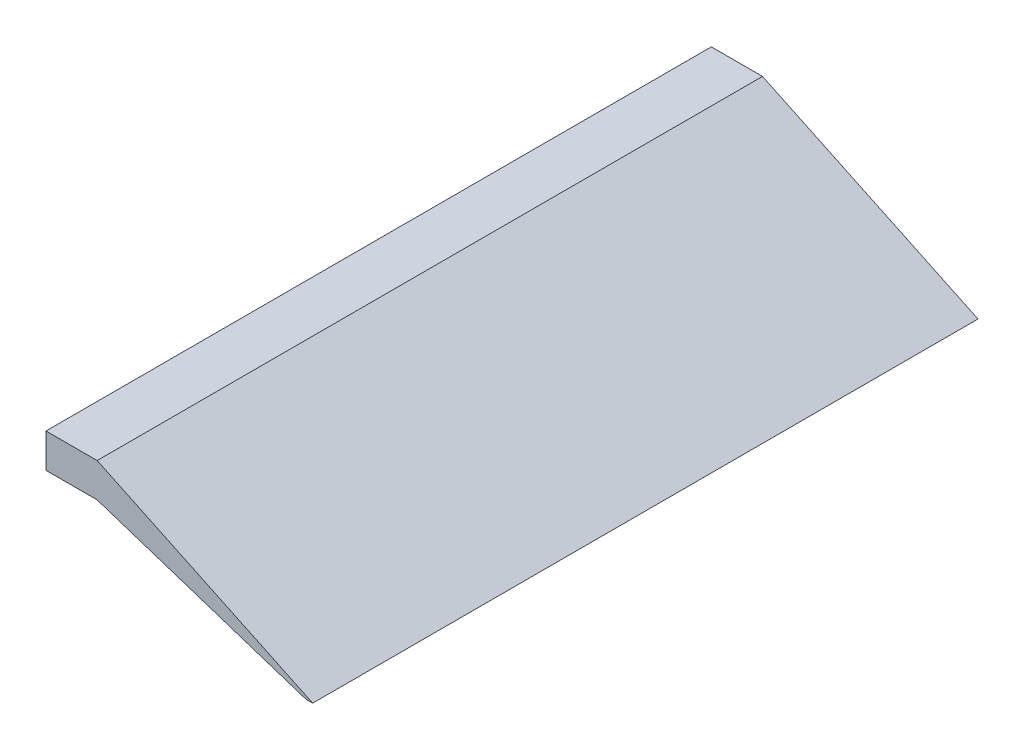
ISO-10303-21;
HEADER;
FILE_DESCRIPTION(('STEP AP214'),'2;1');
FILE_NAME('part.step','',(''),(''),'','','');
FILE_SCHEMA(('AUTOMOTIVE_DESIGN { 1 0 10303 214 1 1 1 1 }'));
ENDSEC;
DATA;
#1=APPLICATION_CONTEXT('core data for automotive mechanical design processes');
#2=APPLICATION_PROTOCOL_DEFINITION('international standard','automotive_design',2000,#1);
#3=PRODUCT_CONTEXT('',#1,'mechanical');
#4=PRODUCT('Part','Part','',(#3));
#5=PRODUCT_RELATED_PRODUCT_CATEGORY('part','',(#4));
#6=PRODUCT_DEFINITION_FORMATION('','',#4);
#7=PRODUCT_DEFINITION_CONTEXT('part definition',#1,'design');
#8=PRODUCT_DEFINITION('design','',#6,#7);
#9=PRODUCT_DEFINITION_SHAPE('','',#8);
#10=(LENGTH_UNIT() NAMED_UNIT(*) SI_UNIT(.MILLI.,.METRE.));
#11=(NAMED_UNIT(*) PLANE_ANGLE_UNIT() SI_UNIT($,.RADIAN.));
#12=(NAMED_UNIT(*) SI_UNIT($,.STERADIAN.) SOLID_ANGLE_UNIT());
#13=UNCERTAINTY_MEASURE_WITH_UNIT(LENGTH_MEASURE(1.E-05),#10,'distance_accuracy_value','');
#14=(GEOMETRIC_REPRESENTATION_CONTEXT(3) GLOBAL_UNCERTAINTY_ASSIGNED_CONTEXT((#13)) GLOBAL_UNIT_ASSIGNED_CONTEXT((#10,
#11,#12)) REPRESENTATION_CONTEXT('',''));
#15=CARTESIAN_POINT('',(0.,0.,0.));
#16=DIRECTION('',(0.,0.,1.));
#17=DIRECTION('',(1.,0.,0.));
#18=AXIS2_PLACEMENT_3D('',#15,#16,#17);
#19=CARTESIAN_POINT('',(-15.,9.99999999999999,-97.5));
#20=DIRECTION('',(0.,0.,-1.));
#21=DIRECTION('',(-1.,0.,0.));
#22=AXIS2_PLACEMENT_3D('',#19,#20,#21);
#23=PLANE('',#22);
#24=DIRECTION('',(1.,0.,0.));
#25=VECTOR('',#24,1.);
#26=CARTESIAN_POINT('',(-15.,9.99999999999999,-97.5));
#27=LINE('',#26,#25);
#28=CARTESIAN_POINT('',(-15.,9.99999999999999,-97.5));
#29=VERTEX_POINT('',#28);
#30=CARTESIAN_POINT('',(0.,9.99999999999999,-97.5));
#31=VERTEX_POINT('',#30);
#32=EDGE_CURVE('E42',#29,#31,#27,.T.);
#33=ORIENTED_EDGE('',*,*,#32,.T.);
#34=DIRECTION('',(0.903292533340969,-0.429025173166395,0.));
#35=VECTOR('',#34,1.);
#36=CARTESIAN_POINT('',(0.,9.99999999999999,-97.5));
#37=LINE('',#36,#35);
#38=CARTESIAN_POINT('',(63.1636036650907,-20.,-97.5));
#39=VERTEX_POINT('',#38);
#40=EDGE_CURVE('E130',#31,#39,#37,.T.);
#41=ORIENTED_EDGE('',*,*,#40,.T.);
#42=DIRECTION('',(1.,0.,0.));
#43=VECTOR('',#42,1.);
#44=CARTESIAN_POINT('',(61.1636036650907,-20.,-97.5));
#45=LINE('',#44,#43);
#46=CARTESIAN_POINT('',(61.1636036650907,-20.,-97.5));
#47=VERTEX_POINT('',#46);
#48=EDGE_CURVE('E113',#47,#39,#45,.T.);
#49=ORIENTED_EDGE('',*,*,#48,.F.);
#50=DIRECTION('',(0.950476016379504,-0.310797912295672,0.));
#51=VECTOR('',#50,1.);
#52=CARTESIAN_POINT('',(0.,0.,-97.5));
#53=LINE('',#52,#51);
#54=CARTESIAN_POINT('',(0.,0.,-97.5));
#55=VERTEX_POINT('',#54);
#56=EDGE_CURVE('E123',#55,#47,#53,.T.);
#57=ORIENTED_EDGE('',*,*,#56,.F.);
#58=DIRECTION('',(1.,0.,0.));
#59=VECTOR('',#58,1.);
#60=CARTESIAN_POINT('',(-15.,0.,-97.5));
#61=LINE('',#60,#59);
#62=CARTESIAN_POINT('',(-15.,0.,-97.5));
#63=VERTEX_POINT('',#62);
#64=EDGE_CURVE('E11',#63,#55,#61,.T.);
#65=ORIENTED_EDGE('',*,*,#64,.F.);
#66=DIRECTION('',(0.,1.,0.));
#67=VECTOR('',#66,1.);
#68=CARTESIAN_POINT('',(-15.,9.99999999999999,-97.5));
#69=LINE('',#68,#67);
#70=EDGE_CURVE('E137',#63,#29,#69,.T.);
#71=ORIENTED_EDGE('',*,*,#70,.T.);
#72=EDGE_LOOP('',(#33,#41,#49,#57,#65,#71));
#73=FACE_BOUND('',#72,.T.);
#74=ADVANCED_FACE('F39',(#73),#23,.T.);
#75=CARTESIAN_POINT('',(-15.,0.,97.5));
#76=DIRECTION('',(0.,-1.,0.));
#77=DIRECTION('',(0.,0.,-1.));
#78=AXIS2_PLACEMENT_3D('',#75,#76,#77);
#79=PLANE('',#78);
#80=DIRECTION('',(0.,0.,-1.));
#81=VECTOR('',#80,1.);
#82=CARTESIAN_POINT('',(0.,0.,97.5));
#83=LINE('',#82,#81);
#84=CARTESIAN_POINT('',(0.,0.,97.5));
#85=VERTEX_POINT('',#84);
#86=EDGE_CURVE('E141',#85,#55,#83,.T.);
#87=ORIENTED_EDGE('',*,*,#86,.F.);
#88=DIRECTION('',(1.,0.,0.));
#89=VECTOR('',#88,1.);
#90=CARTESIAN_POINT('',(-15.,0.,97.5));
#91=LINE('',#90,#89);
#92=CARTESIAN_POINT('',(-15.,0.,97.5));
#93=VERTEX_POINT('',#92);
#94=EDGE_CURVE('E49',#93,#85,#91,.T.);
#95=ORIENTED_EDGE('',*,*,#94,.F.);
#96=DIRECTION('',(0.,0.,-1.));
#97=VECTOR('',#96,1.);
#98=CARTESIAN_POINT('',(-15.,0.,97.5));
#99=LINE('',#98,#97);
#100=EDGE_CURVE('E147',#93,#63,#99,.T.);
#101=ORIENTED_EDGE('',*,*,#100,.T.);
#102=ORIENTED_EDGE('',*,*,#64,.T.);
#103=EDGE_LOOP('',(#87,#95,#101,#102));
#104=FACE_BOUND('',#103,.T.);
#105=ADVANCED_FACE('F169',(#104),#79,.T.);
#106=CARTESIAN_POINT('',(-15.,9.99999999999999,97.5));
#107=DIRECTION('',(0.,0.,1.));
#108=DIRECTION('',(1.,0.,0.));
#109=AXIS2_PLACEMENT_3D('',#106,#107,#108);
#110=PLANE('',#109);
#111=ORIENTED_EDGE('',*,*,#94,.T.);
#112=DIRECTION('',(0.950476016379504,-0.310797912295672,0.));
#113=VECTOR('',#112,1.);
#114=CARTESIAN_POINT('',(0.,0.,97.5));
#115=LINE('',#114,#113);
#116=CARTESIAN_POINT('',(61.1636036650907,-20.,97.5));
#117=VERTEX_POINT('',#116);
#118=EDGE_CURVE('E103',#85,#117,#115,.T.);
#119=ORIENTED_EDGE('',*,*,#118,.T.);
#120=DIRECTION('',(1.,0.,0.));
#121=VECTOR('',#120,1.);
#122=CARTESIAN_POINT('',(61.1636036650907,-20.,97.5));
#123=LINE('',#122,#121);
#124=CARTESIAN_POINT('',(63.1636036650907,-20.,97.5));
#125=VERTEX_POINT('',#124);
#126=EDGE_CURVE('E97',#117,#125,#123,.T.);
#127=ORIENTED_EDGE('',*,*,#126,.T.);
#128=DIRECTION('',(0.903292533340969,-0.429025173166395,0.));
#129=VECTOR('',#128,1.);
#130=CARTESIAN_POINT('',(0.,9.99999999999999,97.5));
#131=LINE('',#130,#129);
#132=CARTESIAN_POINT('',(0.,9.99999999999999,97.5));
#133=VERTEX_POINT('',#132);
#134=EDGE_CURVE('E101',#133,#125,#131,.T.);
#135=ORIENTED_EDGE('',*,*,#134,.F.);
#136=DIRECTION('',(1.,0.,0.));
#137=VECTOR('',#136,1.);
#138=CARTESIAN_POINT('',(-15.,9.99999999999999,97.5));
#139=LINE('',#138,#137);
#140=CARTESIAN_POINT('',(-15.,9.99999999999999,97.5));
#141=VERTEX_POINT('',#140);
#142=EDGE_CURVE('E72',#141,#133,#139,.T.);
#143=ORIENTED_EDGE('',*,*,#142,.F.);
#144=DIRECTION('',(0.,-1.,0.));
#145=VECTOR('',#144,1.);
#146=CARTESIAN_POINT('',(-15.,9.99999999999999,97.5));
#147=LINE('',#146,#145);
#148=EDGE_CURVE('E144',#141,#93,#147,.T.);
#149=ORIENTED_EDGE('',*,*,#148,.T.);
#150=EDGE_LOOP('',(#111,#119,#127,#135,#143,#149));
#151=FACE_BOUND('',#150,.T.);
#152=ADVANCED_FACE('F99',(#151),#110,.T.);
#153=CARTESIAN_POINT('',(-15.,9.99999999999999,97.5));
#154=DIRECTION('',(0.,1.,0.));
#155=DIRECTION('',(0.,0.,1.));
#156=AXIS2_PLACEMENT_3D('',#153,#154,#155);
#157=PLANE('',#156);
#158=DIRECTION('',(0.,0.,1.));
#159=VECTOR('',#158,1.);
#160=CARTESIAN_POINT('',(0.,9.99999999999999,97.5));
#161=LINE('',#160,#159);
#162=EDGE_CURVE('E121',#31,#133,#161,.T.);
#163=ORIENTED_EDGE('',*,*,#162,.F.);
#164=ORIENTED_EDGE('',*,*,#32,.F.);
#165=DIRECTION('',(0.,0.,1.));
#166=VECTOR('',#165,1.);
#167=CARTESIAN_POINT('',(-15.,9.99999999999999,97.5));
#168=LINE('',#167,#166);
#169=EDGE_CURVE('E140',#29,#141,#168,.T.);
#170=ORIENTED_EDGE('',*,*,#169,.T.);
#171=ORIENTED_EDGE('',*,*,#142,.T.);
#172=EDGE_LOOP('',(#163,#164,#170,#171));
#173=FACE_BOUND('',#172,.T.);
#174=ADVANCED_FACE('F159',(#173),#157,.T.);
#175=CARTESIAN_POINT('',(-15.,0.,0.));
#176=DIRECTION('',(1.,0.,0.));
#177=DIRECTION('',(0.,0.,-1.));
#178=AXIS2_PLACEMENT_3D('',#175,#176,#177);
#179=PLANE('',#178);
#180=ORIENTED_EDGE('',*,*,#70,.F.);
#181=ORIENTED_EDGE('',*,*,#100,.F.);
#182=ORIENTED_EDGE('',*,*,#148,.F.);
#183=ORIENTED_EDGE('',*,*,#169,.F.);
#184=EDGE_LOOP('',(#180,#181,#182,#183));
#185=FACE_BOUND('',#184,.T.);
#186=ADVANCED_FACE('F161',(#185),#179,.F.);
#187=CARTESIAN_POINT('',(0.,0.,97.5));
#188=DIRECTION('',(0.310797912295672,0.950476016379504,0.));
#189=DIRECTION('',(-0.950476016379504,0.310797912295672,0.));
#190=AXIS2_PLACEMENT_3D('',#187,#188,#189);
#191=PLANE('',#190);
#192=ORIENTED_EDGE('',*,*,#56,.T.);
#193=DIRECTION('',(0.,0.,-1.));
#194=VECTOR('',#193,1.);
#195=CARTESIAN_POINT('',(61.1636036650907,-20.,97.5));
#196=LINE('',#195,#194);
#197=EDGE_CURVE('E118',#117,#47,#196,.T.);
#198=ORIENTED_EDGE('',*,*,#197,.F.);
#199=ORIENTED_EDGE('',*,*,#118,.F.);
#200=ORIENTED_EDGE('',*,*,#86,.T.);
#201=EDGE_LOOP('',(#192,#198,#199,#200));
#202=FACE_BOUND('',#201,.T.);
#203=ADVANCED_FACE('F166',(#202),#191,.F.);
#204=CARTESIAN_POINT('',(61.1636036650907,-20.,97.5));
#205=DIRECTION('',(0.,1.,0.));
#206=DIRECTION('',(0.,0.,1.));
#207=AXIS2_PLACEMENT_3D('',#204,#205,#206);
#208=PLANE('',#207);
#209=ORIENTED_EDGE('',*,*,#48,.T.);
#210=DIRECTION('',(0.,0.,-1.));
#211=VECTOR('',#210,1.);
#212=CARTESIAN_POINT('',(63.1636036650907,-20.,97.5));
#213=LINE('',#212,#211);
#214=EDGE_CURVE('E110',#125,#39,#213,.T.);
#215=ORIENTED_EDGE('',*,*,#214,.F.);
#216=ORIENTED_EDGE('',*,*,#126,.F.);
#217=ORIENTED_EDGE('',*,*,#197,.T.);
#218=EDGE_LOOP('',(#209,#215,#216,#217));
#219=FACE_BOUND('',#218,.T.);
#220=ADVANCED_FACE('F111',(#219),#208,.F.);
#221=CARTESIAN_POINT('',(0.,9.99999999999999,97.5));
#222=DIRECTION('',(0.429025173166395,0.903292533340969,0.));
#223=DIRECTION('',(-0.903292533340969,0.429025173166395,0.));
#224=AXIS2_PLACEMENT_3D('',#221,#222,#223);
#225=PLANE('',#224);
#226=ORIENTED_EDGE('',*,*,#40,.F.);
#227=ORIENTED_EDGE('',*,*,#162,.T.);
#228=ORIENTED_EDGE('',*,*,#134,.T.);
#229=ORIENTED_EDGE('',*,*,#214,.T.);
#230=EDGE_LOOP('',(#226,#227,#228,#229));
#231=FACE_BOUND('',#230,.T.);
#232=ADVANCED_FACE('F120',(#231),#225,.T.);
#233=CLOSED_SHELL('',(#74,#105,#152,#174,#186,#203,#220,#232));
#234=MANIFOLD_SOLID_BREP('B2',#233);
#235=ADVANCED_BREP_SHAPE_REPRESENTATION('',(#18,#234),#14);
#236=SHAPE_DEFINITION_REPRESENTATION(#9,#235);
ENDSEC;
END-ISO-10303-21;
